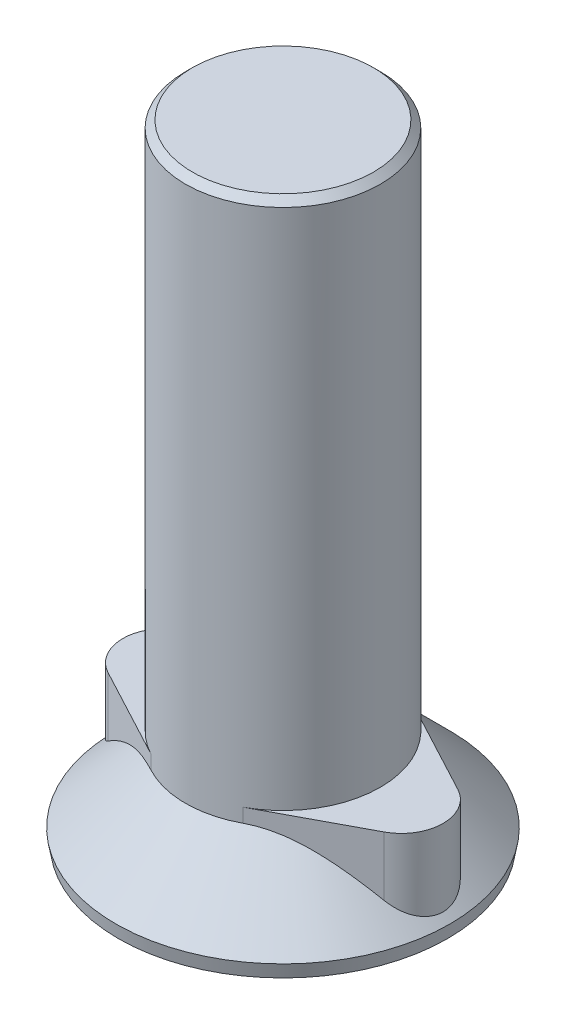
ISO-10303-21;
HEADER;
FILE_DESCRIPTION(('STEP AP214'),'2;1');
FILE_NAME('part.step','',(''),(''),'','','');
FILE_SCHEMA(('AUTOMOTIVE_DESIGN { 1 0 10303 214 1 1 1 1 }'));
ENDSEC;
DATA;
#1=APPLICATION_CONTEXT('core data for automotive mechanical design processes');
#2=APPLICATION_PROTOCOL_DEFINITION('international standard','automotive_design',2000,#1);
#3=PRODUCT_CONTEXT('',#1,'mechanical');
#4=PRODUCT('Part','Part','',(#3));
#5=PRODUCT_RELATED_PRODUCT_CATEGORY('part','',(#4));
#6=PRODUCT_DEFINITION_FORMATION('','',#4);
#7=PRODUCT_DEFINITION_CONTEXT('part definition',#1,'design');
#8=PRODUCT_DEFINITION('design','',#6,#7);
#9=PRODUCT_DEFINITION_SHAPE('','',#8);
#10=(LENGTH_UNIT() NAMED_UNIT(*) SI_UNIT(.MILLI.,.METRE.));
#11=(NAMED_UNIT(*) PLANE_ANGLE_UNIT() SI_UNIT($,.RADIAN.));
#12=(NAMED_UNIT(*) SI_UNIT($,.STERADIAN.) SOLID_ANGLE_UNIT());
#13=UNCERTAINTY_MEASURE_WITH_UNIT(LENGTH_MEASURE(1.E-05),#10,'distance_accuracy_value','');
#14=(GEOMETRIC_REPRESENTATION_CONTEXT(3) GLOBAL_UNCERTAINTY_ASSIGNED_CONTEXT((#13)) GLOBAL_UNIT_ASSIGNED_CONTEXT((#10,
#11,#12)) REPRESENTATION_CONTEXT('',''));
#15=CARTESIAN_POINT('',(0.,0.,0.));
#16=DIRECTION('',(0.,0.,1.));
#17=DIRECTION('',(1.,0.,0.));
#18=AXIS2_PLACEMENT_3D('',#15,#16,#17);
#19=CARTESIAN_POINT('',(0.,1.,0.));
#20=DIRECTION('',(0.,1.,0.));
#21=DIRECTION('',(-1.,0.,0.));
#22=AXIS2_PLACEMENT_3D('',#19,#20,#21);
#23=CONICAL_SURFACE('',#22,12.,0.174532925199435);
#24=CARTESIAN_POINT('',(0.,0.,0.));
#25=DIRECTION('',(0.,-1.,0.));
#26=DIRECTION('',(1.,0.,0.));
#27=AXIS2_PLACEMENT_3D('',#24,#25,#26);
#28=CIRCLE('',#27,11.8236730192915);
#29=CARTESIAN_POINT('',(11.8236730192915,0.,0.));
#30=VERTEX_POINT('',#29);
#31=EDGE_CURVE('E142',#30,#30,#28,.T.);
#32=ORIENTED_EDGE('',*,*,#31,.F.);
#33=EDGE_LOOP('',(#32));
#34=FACE_BOUND('',#33,.T.);
#35=CARTESIAN_POINT('',(0.,1.,0.));
#36=DIRECTION('',(0.,-1.,0.));
#37=DIRECTION('',(1.,0.,0.));
#38=AXIS2_PLACEMENT_3D('',#35,#36,#37);
#39=CIRCLE('',#38,12.);
#40=CARTESIAN_POINT('',(12.,1.,0.));
#41=VERTEX_POINT('',#40);
#42=EDGE_CURVE('E135',#41,#41,#39,.T.);
#43=ORIENTED_EDGE('',*,*,#42,.T.);
#44=EDGE_LOOP('',(#43));
#45=FACE_BOUND('',#44,.T.);
#46=ADVANCED_FACE('F17',(#34,#45),#23,.T.);
#47=CARTESIAN_POINT('',(-11.8236730192915,0.,0.));
#48=DIRECTION('',(0.,1.,0.));
#49=DIRECTION('',(-1.,0.,0.));
#50=AXIS2_PLACEMENT_3D('',#47,#48,#49);
#51=PLANE('',#50);
#52=ORIENTED_EDGE('',*,*,#31,.T.);
#53=EDGE_LOOP('',(#52));
#54=FACE_BOUND('',#53,.T.);
#55=ADVANCED_FACE('F206',(#54),#51,.F.);
#56=CARTESIAN_POINT('',(-7.,45.,0.));
#57=DIRECTION('',(0.,-1.,0.));
#58=DIRECTION('',(1.,0.,0.));
#59=AXIS2_PLACEMENT_3D('',#56,#57,#58);
#60=PLANE('',#59);
#61=CARTESIAN_POINT('',(0.,45.,0.));
#62=DIRECTION('',(0.,-1.,0.));
#63=DIRECTION('',(1.,0.,0.));
#64=AXIS2_PLACEMENT_3D('',#61,#62,#63);
#65=CIRCLE('',#64,6.5);
#66=CARTESIAN_POINT('',(6.5,45.,0.));
#67=VERTEX_POINT('',#66);
#68=EDGE_CURVE('E148',#67,#67,#65,.F.);
#69=ORIENTED_EDGE('',*,*,#68,.T.);
#70=EDGE_LOOP('',(#69));
#71=FACE_BOUND('',#70,.T.);
#72=ADVANCED_FACE('F209',(#71),#60,.F.);
#73=CARTESIAN_POINT('',(0.,0.,0.));
#74=DIRECTION('',(0.,-1.,0.));
#75=DIRECTION('',(1.,0.,0.));
#76=AXIS2_PLACEMENT_3D('',#73,#74,#75);
#77=CYLINDRICAL_SURFACE('',#76,7.);
#78=CARTESIAN_POINT('',(0.,7.,0.));
#79=DIRECTION('',(0.,1.,0.));
#80=DIRECTION('',(0.,0.,1.));
#81=AXIS2_PLACEMENT_3D('',#78,#79,#80);
#82=CIRCLE('',#81,7.);
#83=CARTESIAN_POINT('',(-3.29411764705882,7.,-6.1764705882353));
#84=VERTEX_POINT('',#83);
#85=CARTESIAN_POINT('',(-3.29411764705883,7.,6.1764705882353));
#86=VERTEX_POINT('',#85);
#87=EDGE_CURVE('E25',#84,#86,#82,.T.);
#88=ORIENTED_EDGE('',*,*,#87,.T.);
#89=DIRECTION('',(0.,1.,0.));
#90=VECTOR('',#89,1.);
#91=CARTESIAN_POINT('',(-3.29411764705883,-49.3648826841678,6.17647058823529));
#92=LINE('',#91,#90);
#93=CARTESIAN_POINT('',(-3.29411764705882,6.,6.1764705882353));
#94=VERTEX_POINT('',#93);
#95=EDGE_CURVE('E123',#94,#86,#92,.T.);
#96=ORIENTED_EDGE('',*,*,#95,.F.);
#97=CARTESIAN_POINT('',(0.,6.,0.));
#98=DIRECTION('',(0.,-1.,0.));
#99=DIRECTION('',(1.,0.,0.));
#100=AXIS2_PLACEMENT_3D('',#97,#98,#99);
#101=CIRCLE('',#100,7.);
#102=CARTESIAN_POINT('',(3.29411764705882,6.,6.17647058823529));
#103=VERTEX_POINT('',#102);
#104=EDGE_CURVE('E139',#103,#94,#101,.T.);
#105=ORIENTED_EDGE('',*,*,#104,.F.);
#106=DIRECTION('',(0.,1.,0.));
#107=VECTOR('',#106,1.);
#108=CARTESIAN_POINT('',(3.29411764705882,-49.3648826841678,6.17647058823529));
#109=LINE('',#108,#107);
#110=CARTESIAN_POINT('',(3.29411764705883,7.,6.1764705882353));
#111=VERTEX_POINT('',#110);
#112=EDGE_CURVE('E90',#103,#111,#109,.T.);
#113=ORIENTED_EDGE('',*,*,#112,.T.);
#114=CARTESIAN_POINT('',(3.29411764705883,7.,-6.17647058823529));
#115=VERTEX_POINT('',#114);
#116=EDGE_CURVE('E11',#111,#115,#82,.T.);
#117=ORIENTED_EDGE('',*,*,#116,.T.);
#118=DIRECTION('',(0.,1.,0.));
#119=VECTOR('',#118,1.);
#120=CARTESIAN_POINT('',(3.29411764705883,-49.3648826841678,-6.1764705882353));
#121=LINE('',#120,#119);
#122=CARTESIAN_POINT('',(3.29411764705883,6.,-6.1764705882353));
#123=VERTEX_POINT('',#122);
#124=EDGE_CURVE('E131',#123,#115,#121,.T.);
#125=ORIENTED_EDGE('',*,*,#124,.F.);
#126=CARTESIAN_POINT('',(-3.29411764705883,6.,-6.17647058823529));
#127=VERTEX_POINT('',#126);
#128=EDGE_CURVE('E138',#127,#123,#101,.T.);
#129=ORIENTED_EDGE('',*,*,#128,.F.);
#130=DIRECTION('',(0.,1.,0.));
#131=VECTOR('',#130,1.);
#132=CARTESIAN_POINT('',(-3.29411764705883,-49.3648826841678,-6.17647058823529));
#133=LINE('',#132,#131);
#134=EDGE_CURVE('E37',#127,#84,#133,.T.);
#135=ORIENTED_EDGE('',*,*,#134,.T.);
#136=EDGE_LOOP('',(#88,#96,#105,#113,#117,#125,#129,#135));
#137=FACE_BOUND('',#136,.T.);
#138=CARTESIAN_POINT('',(0.,44.5,0.));
#139=DIRECTION('',(0.,-1.,0.));
#140=DIRECTION('',(1.,0.,0.));
#141=AXIS2_PLACEMENT_3D('',#138,#139,#140);
#142=CIRCLE('',#141,7.);
#143=CARTESIAN_POINT('',(7.,44.5,0.));
#144=VERTEX_POINT('',#143);
#145=EDGE_CURVE('E145',#144,#144,#142,.T.);
#146=ORIENTED_EDGE('',*,*,#145,.T.);
#147=EDGE_LOOP('',(#146));
#148=FACE_BOUND('',#147,.T.);
#149=ADVANCED_FACE('F168',(#137,#148),#77,.T.);
#150=CARTESIAN_POINT('',(0.,6.,0.));
#151=DIRECTION('',(0.,-1.,0.));
#152=DIRECTION('',(1.,0.,0.));
#153=AXIS2_PLACEMENT_3D('',#150,#151,#152);
#154=CONICAL_SURFACE('',#153,7.,0.785398163397448);
#155=ORIENTED_EDGE('',*,*,#42,.F.);
#156=EDGE_LOOP('',(#155));
#157=FACE_BOUND('',#156,.T.);
#158=CARTESIAN_POINT('',(9.91156470588231,2.74102344285751,-2.6471654804918));
#159=CARTESIAN_POINT('',(9.98356228763569,2.6813690233866,-2.60875989639891));
#160=CARTESIAN_POINT('',(10.0547429674275,2.62291515063858,-2.56704011813073));
#161=CARTESIAN_POINT('',(10.1949975272901,2.50865949377154,-2.47668735347328));
#162=CARTESIAN_POINT('',(10.2640684597244,2.4528613643923,-2.42804518802902));
#163=CARTESIAN_POINT('',(10.4678434949442,2.289482024667,-2.27091453220468));
#164=CARTESIAN_POINT('',(10.5983245482079,2.18656351899434,-2.15162883713195));
#165=CARTESIAN_POINT('',(10.8179042134572,2.01545301821251,-1.91015412583546));
#166=CARTESIAN_POINT('',(10.9101511546149,1.94438047277255,-1.79284614702168));
#167=CARTESIAN_POINT('',(11.078544813732,1.81566307592463,-1.54075747818758));
#168=CARTESIAN_POINT('',(11.1547303186206,1.7579858409634,-1.40602017947054));
#169=CARTESIAN_POINT('',(11.2540827336964,1.68319667344774,-1.19219020079018));
#170=CARTESIAN_POINT('',(11.2848240043158,1.66013911881172,-1.11857608195092));
#171=CARTESIAN_POINT('',(11.3406495909173,1.61837100402448,-0.968059210193679));
#172=CARTESIAN_POINT('',(11.3657368330645,1.59965819515741,-0.89115818299993));
#173=CARTESIAN_POINT('',(11.4097950524654,1.5668557800292,-0.734643603530447));
#174=CARTESIAN_POINT('',(11.4287651648005,1.55276682754342,-0.655029669427046));
#175=CARTESIAN_POINT('',(11.4602113681981,1.52944091135658,-0.493863445710435));
#176=CARTESIAN_POINT('',(11.4726884763174,1.52020318776236,-0.412311461765094));
#177=CARTESIAN_POINT('',(11.4975567004263,1.50179903537242,-0.187528070329149));
#178=CARTESIAN_POINT('',(11.5031404568797,1.49767820549859,-0.0430304253434814));
#179=CARTESIAN_POINT('',(11.4934677937953,1.50482887618203,0.244746720529866));
#180=CARTESIAN_POINT('',(11.4782205054963,1.51609363250375,0.388026727469596));
#181=CARTESIAN_POINT('',(11.4292912768308,1.55236907438785,0.661431682632851));
#182=CARTESIAN_POINT('',(11.3966495011321,1.57660445860896,0.791849172672381));
#183=CARTESIAN_POINT('',(11.3154001499868,1.63722236263834,1.04458454172066));
#184=CARTESIAN_POINT('',(11.2667907200699,1.67360629337692,1.16690147795408));
#185=CARTESIAN_POINT('',(11.1523951334627,1.75977399970764,1.40846076964904));
#186=CARTESIAN_POINT('',(11.0857251433339,1.81025327532063,1.52703288430873));
#187=CARTESIAN_POINT('',(10.9398166952657,1.92164347121221,1.75076046805283));
#188=CARTESIAN_POINT('',(10.8605706292932,1.98256070783794,1.85590774570395));
#189=CARTESIAN_POINT('',(10.6797756354149,2.12287681013191,2.06654372299627));
#190=CARTESIAN_POINT('',(10.5766629248118,2.20367701541225,2.16974887682783));
#191=CARTESIAN_POINT('',(10.3613784534969,2.37452551412365,2.35704138781548));
#192=CARTESIAN_POINT('',(10.2492078988461,2.46457257675891,2.44113128451714));
#193=CARTESIAN_POINT('',(10.0609620453849,2.61780602763353,2.563395423371));
#194=CARTESIAN_POINT('',(9.98666376414196,2.67879336612834,2.6071233447852));
#195=CARTESIAN_POINT('',(9.91156470588247,2.74102344285723,2.64716548049241));
#196=B_SPLINE_CURVE_WITH_KNOTS('',3,(#158,#159,#160,#161,#162,#163,#164,#165,#166,#167,#168,
#169,#170,#171,#172,#173,#174,#175,#176,#177,#178,#179,#180,#181,#182,#183,#184,#185,#186,#187,
#188,#189,#190,#191,#192,#193,#194,#195),.UNSPECIFIED.,.F.,.F.,(4,2,2,2,2,2,2,2,2,2,2,2,2,2,2,2,
2,2,4),(0.,0.303094887368615,0.606595488202654,1.21685044894229,1.71086386790831,
2.20367026572788,2.45248273555658,2.70116613867642,2.94988468845559,3.19856426750302,
3.63007339172932,4.06139342563936,4.46941718691488,4.8774883524999,5.31107016433642,
5.74491528316431,6.24340392627657,6.74182630423488,7.05823895159525),.UNSPECIFIED.);
#197=CARTESIAN_POINT('',(9.91176470588235,2.74085773565842,-2.64705882352941));
#198=VERTEX_POINT('',#197);
#199=CARTESIAN_POINT('',(9.91176470588235,2.74085773565842,2.64705882352942));
#200=VERTEX_POINT('',#199);
#201=EDGE_CURVE('E189',#198,#200,#196,.T.);
#202=ORIENTED_EDGE('',*,*,#201,.T.);
#203=CARTESIAN_POINT('',(9.91196470588235,2.74069202863187,2.64695215686275));
#204=CARTESIAN_POINT('',(9.72835052259684,2.89277280279003,2.74487972128169));
#205=CARTESIAN_POINT('',(9.54352151818006,3.04301127560552,2.84345519030397));
#206=CARTESIAN_POINT('',(9.17089129154001,3.33888277104574,3.04219131117866));
#207=CARTESIAN_POINT('',(8.9830887219807,3.48451361080487,3.14235268161029));
#208=CARTESIAN_POINT('',(8.60198495881039,3.77172880173203,3.34560802196779));
#209=CARTESIAN_POINT('',(8.40864552374487,3.91324831382766,3.44872238733607));
#210=CARTESIAN_POINT('',(8.01802078995133,4.18905779346685,3.65705557869262));
#211=CARTESIAN_POINT('',(7.8207360738577,4.32334881784821,3.76227409394256));
#212=CARTESIAN_POINT('',(7.43095847625734,4.57680979081243,3.97015547932942));
#213=CARTESIAN_POINT('',(7.23867786540349,4.69639408454862,4.07270513845147));
#214=CARTESIAN_POINT('',(6.84944967017922,4.92532994224692,4.28029350923774));
#215=CARTESIAN_POINT('',(6.65250121543302,5.03467957871976,4.38533268510238));
#216=CARTESIAN_POINT('',(6.05553260949519,5.34273579066558,4.70371594160256));
#217=CARTESIAN_POINT('',(5.64740426392446,5.52279774997197,4.92138439257362));
#218=CARTESIAN_POINT('',(5.07373263845529,5.7171686094611,5.22734259282384));
#219=CARTESIAN_POINT('',(4.91678444013114,5.76456152448375,5.31104829859672));
#220=CARTESIAN_POINT('',(4.6003783765999,5.84729209850646,5.47979819914671));
#221=CARTESIAN_POINT('',(4.44092024180351,5.88262845315405,5.56484253770479));
#222=CARTESIAN_POINT('',(4.11749377145424,5.94042908089592,5.7373366552244));
#223=CARTESIAN_POINT('',(3.95349429453841,5.96267397825909,5.82480304291284));
#224=CARTESIAN_POINT('',(3.70666436163076,5.98502086323628,5.95644567379692));
#225=CARTESIAN_POINT('',(3.62420063374052,5.99063313364621,6.00042632867172));
#226=CARTESIAN_POINT('',(3.45913349702899,5.99812685374959,6.08846213491787));
#227=CARTESIAN_POINT('',(3.37653007537661,6.00000793975191,6.13251729313247));
#228=CARTESIAN_POINT('',(3.29391764705882,5.99999999633017,6.17657725490196));
#229=B_SPLINE_CURVE_WITH_KNOTS('',3,(#203,#204,#205,#206,#207,#208,#209,#210,#211,#212,#213,
#214,#215,#216,#217,#218,#219,#220,#221,#222,#223,#224,#225,#226,#227,#228),.UNSPECIFIED.,.F.,
.F.,(4,2,2,2,2,2,2,2,2,2,2,2,4),(0.,0.773261265163307,1.54688353824095,2.32930229541198,
3.11160634693998,3.85704643188644,4.60262662399333,6.08594642886971,6.63785559643804,
7.18982445399828,7.75079718467654,8.03161328698054,8.31245676003215),.UNSPECIFIED.);
#230=EDGE_CURVE('E87',#200,#103,#229,.T.);
#231=ORIENTED_EDGE('',*,*,#230,.T.);
#232=ORIENTED_EDGE('',*,*,#104,.T.);
#233=CARTESIAN_POINT('',(-3.29391764705882,5.99999999633016,6.17657725490196));
#234=CARTESIAN_POINT('',(-3.38889550526617,6.00001602368897,6.12592239719137));
#235=CARTESIAN_POINT('',(-3.48386963066223,5.99752443247155,6.07526953031347));
#236=CARTESIAN_POINT('',(-3.67360272343958,5.98761917923993,5.97407854749889));
#237=CARTESIAN_POINT('',(-3.76836172366816,5.98020632761133,5.92354041404365));
#238=CARTESIAN_POINT('',(-3.95731037002711,5.96057015246898,5.8227678026522));
#239=CARTESIAN_POINT('',(-4.05150075190511,5.94835590516197,5.77253293231727));
#240=CARTESIAN_POINT('',(-4.23931958898048,5.91929318588809,5.67236288587707));
#241=CARTESIAN_POINT('',(-4.33294802478376,5.90244455490671,5.62242772011532));
#242=CARTESIAN_POINT('',(-4.609504255713,5.84593062841855,5.47493106361973));
#243=CARTESIAN_POINT('',(-4.79144702353566,5.79993391018451,5.37789492078098));
#244=CARTESIAN_POINT('',(-5.15182380773045,5.69289389706411,5.18569396921043));
#245=CARTESIAN_POINT('',(-5.33025702439344,5.63184721471962,5.09052958699017));
#246=CARTESIAN_POINT('',(-5.70293729004415,5.48940367187028,4.89176677864312));
#247=CARTESIAN_POINT('',(-5.89673231525854,5.40649757578047,4.78840943186211));
#248=CARTESIAN_POINT('',(-6.27961985863406,5.22765030996915,4.58420274206183));
#249=CARTESIAN_POINT('',(-6.46871035733531,5.13170365290497,4.48335447608783));
#250=CARTESIAN_POINT('',(-6.84299343312791,4.9289316320822,4.28373683566511));
#251=CARTESIAN_POINT('',(-7.02817184209876,4.82207292534491,4.18497501754732));
#252=CARTESIAN_POINT('',(-7.39441126524149,4.59976813186721,3.98964732520453));
#253=CARTESIAN_POINT('',(-7.5754728504216,4.48432324564444,3.89308114644181));
#254=CARTESIAN_POINT('',(-7.94186434907571,4.24120890718177,3.69767234715962));
#255=CARTESIAN_POINT('',(-8.12703107912824,4.11322499506271,3.59891675779827));
#256=CARTESIAN_POINT('',(-8.49393723982107,3.85106887248552,3.40323347209542));
#257=CARTESIAN_POINT('',(-8.67567627456557,3.71689595329477,3.30630598689835));
#258=CARTESIAN_POINT('',(-9.03464495454188,3.4446646536357,3.11485602424433));
#259=CARTESIAN_POINT('',(-9.21189971863898,3.30664864774384,3.02032015005921));
#260=CARTESIAN_POINT('',(-9.56378667996042,3.02653602297223,2.83264710402111));
#261=CARTESIAN_POINT('',(-9.73841982143827,2.8844409297415,2.73950942856625));
#262=CARTESIAN_POINT('',(-9.91196470588235,2.74069202863186,2.64695215686275));
#263=B_SPLINE_CURVE_WITH_KNOTS('',3,(#233,#234,#235,#236,#237,#238,#239,#240,#241,#242,#243,
#244,#245,#246,#247,#248,#249,#250,#251,#252,#253,#254,#255,#256,#257,#258,#259,#260,#261,#262),
.UNSPECIFIED.,.F.,.F.,(4,2,2,2,2,2,2,2,2,2,2,2,2,2,4),(0.,0.322888649853048,0.645724142707506,
0.967952283164564,1.29019148126131,1.92328489100783,2.55652092823922,3.26028188350172,
3.96433989676975,4.67061754875083,5.37679663413047,6.11407510539586,6.85143821655157,
7.58257514629205,8.31344209239549),.UNSPECIFIED.);
#264=CARTESIAN_POINT('',(-9.91176470588235,2.7408577356584,2.64705882352941));
#265=VERTEX_POINT('',#264);
#266=EDGE_CURVE('E151',#94,#265,#263,.T.);
#267=ORIENTED_EDGE('',*,*,#266,.T.);
#268=CARTESIAN_POINT('',(-9.91156470588231,2.74102344285751,2.6471654804918));
#269=CARTESIAN_POINT('',(-9.98356228763569,2.68136902338659,2.60875989639891));
#270=CARTESIAN_POINT('',(-10.0547429674275,2.62291515063856,2.56704011813073));
#271=CARTESIAN_POINT('',(-10.1949975272901,2.50865949377153,2.47668735347328));
#272=CARTESIAN_POINT('',(-10.2640684597244,2.45286136439229,2.42804518802903));
#273=CARTESIAN_POINT('',(-10.4678434949442,2.28948202466699,2.27091453220468));
#274=CARTESIAN_POINT('',(-10.5983245482079,2.18656351899433,2.15162883713195));
#275=CARTESIAN_POINT('',(-10.8179042134572,2.0154530182125,1.91015412583546));
#276=CARTESIAN_POINT('',(-10.9101511546149,1.94438047277254,1.79284614702168));
#277=CARTESIAN_POINT('',(-11.078544813732,1.81566307592462,1.54075747818759));
#278=CARTESIAN_POINT('',(-11.1547303186206,1.75798584096339,1.40602017947054));
#279=CARTESIAN_POINT('',(-11.2540827336964,1.68319667344773,1.19219020079019));
#280=CARTESIAN_POINT('',(-11.2848240043158,1.66013911881171,1.11857608195092));
#281=CARTESIAN_POINT('',(-11.3406495909173,1.61837100402447,0.968059210193682));
#282=CARTESIAN_POINT('',(-11.3657368330645,1.5996581951574,0.891158182999931));
#283=CARTESIAN_POINT('',(-11.4097950524654,1.5668557800292,0.734643603530447));
#284=CARTESIAN_POINT('',(-11.4287651648005,1.55276682754341,0.655029669427047));
#285=CARTESIAN_POINT('',(-11.4602113681981,1.52944091135657,0.493863445710436));
#286=CARTESIAN_POINT('',(-11.4726884763174,1.52020318776235,0.412311461765095));
#287=CARTESIAN_POINT('',(-11.4975567004263,1.50179903537241,0.18752807032915));
#288=CARTESIAN_POINT('',(-11.5031404568797,1.49767820549858,0.0430304253434821));
#289=CARTESIAN_POINT('',(-11.4934677937953,1.50482887618202,-0.244746720529865));
#290=CARTESIAN_POINT('',(-11.4782205054963,1.51609363250374,-0.388026727469594));
#291=CARTESIAN_POINT('',(-11.4292912768308,1.55236907438784,-0.661431682632849));
#292=CARTESIAN_POINT('',(-11.3966495011321,1.57660445860895,-0.791849172672378));
#293=CARTESIAN_POINT('',(-11.3154001499868,1.63722236263833,-1.04458454172065));
#294=CARTESIAN_POINT('',(-11.2667907200699,1.67360629337691,-1.16690147795407));
#295=CARTESIAN_POINT('',(-11.1523951334627,1.75977399970764,-1.40846076964903));
#296=CARTESIAN_POINT('',(-11.0857251433339,1.81025327532062,-1.52703288430872));
#297=CARTESIAN_POINT('',(-10.9398166952657,1.9216434712122,-1.75076046805283));
#298=CARTESIAN_POINT('',(-10.8605706292932,1.98256070783793,-1.85590774570395));
#299=CARTESIAN_POINT('',(-10.6797756354149,2.1228768101319,-2.06654372299627));
#300=CARTESIAN_POINT('',(-10.5766629248118,2.20367701541224,-2.16974887682783));
#301=CARTESIAN_POINT('',(-10.3613784534969,2.37452551412365,-2.35704138781548));
#302=CARTESIAN_POINT('',(-10.2492078988461,2.4645725767589,-2.44113128451714));
#303=CARTESIAN_POINT('',(-10.0609620453849,2.61780602763351,-2.563395423371));
#304=CARTESIAN_POINT('',(-9.98666376414196,2.67879336612833,-2.6071233447852));
#305=CARTESIAN_POINT('',(-9.91156470588248,2.74102344285722,-2.64716548049241));
#306=B_SPLINE_CURVE_WITH_KNOTS('',3,(#268,#269,#270,#271,#272,#273,#274,#275,#276,#277,#278,
#279,#280,#281,#282,#283,#284,#285,#286,#287,#288,#289,#290,#291,#292,#293,#294,#295,#296,#297,
#298,#299,#300,#301,#302,#303,#304,#305),.UNSPECIFIED.,.F.,.F.,(4,2,2,2,2,2,2,2,2,2,2,2,2,2,2,2,
2,2,4),(0.,0.303094887368614,0.606595488202654,1.21685044894229,1.71086386790831,
2.20367026572788,2.45248273555658,2.70116613867642,2.94988468845559,3.19856426750302,
3.63007339172932,4.06139342563936,4.46941718691488,4.8774883524999,5.31107016433642,
5.74491528316431,6.24340392627657,6.74182630423488,7.05823895159524),.UNSPECIFIED.);
#307=CARTESIAN_POINT('',(-9.91176470588235,2.7408577356584,-2.64705882352942));
#308=VERTEX_POINT('',#307);
#309=EDGE_CURVE('E157',#265,#308,#306,.T.);
#310=ORIENTED_EDGE('',*,*,#309,.T.);
#311=CARTESIAN_POINT('',(-9.91196470588235,2.74069202863186,-2.64695215686275));
#312=CARTESIAN_POINT('',(-9.72835052259684,2.89277280279002,-2.74487972128169));
#313=CARTESIAN_POINT('',(-9.54352151818006,3.04301127560551,-2.84345519030397));
#314=CARTESIAN_POINT('',(-9.17089129154001,3.33888277104572,-3.04219131117866));
#315=CARTESIAN_POINT('',(-8.98308872198071,3.48451361080486,-3.14235268161029));
#316=CARTESIAN_POINT('',(-8.6019849588104,3.77172880173202,-3.34560802196779));
#317=CARTESIAN_POINT('',(-8.40864552374487,3.91324831382765,-3.44872238733607));
#318=CARTESIAN_POINT('',(-8.01802078995133,4.18905779346684,-3.65705557869263));
#319=CARTESIAN_POINT('',(-7.82073607385771,4.32334881784819,-3.76227409394256));
#320=CARTESIAN_POINT('',(-7.43095847625734,4.57680979081242,-3.97015547932942));
#321=CARTESIAN_POINT('',(-7.2386778654035,4.6963940845486,-4.07270513845147));
#322=CARTESIAN_POINT('',(-6.84944967017923,4.92532994224691,-4.28029350923775));
#323=CARTESIAN_POINT('',(-6.65250121543302,5.03467957871974,-4.38533268510239));
#324=CARTESIAN_POINT('',(-6.05553260949519,5.34273579066556,-4.70371594160257));
#325=CARTESIAN_POINT('',(-5.64740426392446,5.52279774997196,-4.92138439257362));
#326=CARTESIAN_POINT('',(-5.07373263845529,5.71716860946109,-5.22734259282385));
#327=CARTESIAN_POINT('',(-4.91678444013114,5.76456152448374,-5.31104829859673));
#328=CARTESIAN_POINT('',(-4.60037837659991,5.84729209850644,-5.47979819914672));
#329=CARTESIAN_POINT('',(-4.44092024180352,5.88262845315403,-5.5648425377048));
#330=CARTESIAN_POINT('',(-4.11749377145425,5.9404290808959,-5.73733665522441));
#331=CARTESIAN_POINT('',(-3.95349429453842,5.96267397825907,-5.82480304291285));
#332=CARTESIAN_POINT('',(-3.70666436163077,5.98502086323626,-5.95644567379693));
#333=CARTESIAN_POINT('',(-3.62420063374053,5.9906331336462,-6.00042632867172));
#334=CARTESIAN_POINT('',(-3.459133497029,5.99812685374958,-6.08846213491787));
#335=CARTESIAN_POINT('',(-3.37653007537662,6.00000793975189,-6.13251729313247));
#336=CARTESIAN_POINT('',(-3.29391764705882,5.99999999633016,-6.17657725490196));
#337=B_SPLINE_CURVE_WITH_KNOTS('',3,(#311,#312,#313,#314,#315,#316,#317,#318,#319,#320,#321,
#322,#323,#324,#325,#326,#327,#328,#329,#330,#331,#332,#333,#334,#335,#336),.UNSPECIFIED.,.F.,
.F.,(4,2,2,2,2,2,2,2,2,2,2,2,4),(0.,0.773261265163306,1.54688353824095,2.32930229541198,
3.11160634693998,3.85704643188644,4.60262662399333,6.08594642886971,6.63785559643804,
7.18982445399828,7.75079718467654,8.03161328698054,8.31245676003215),.UNSPECIFIED.);
#338=EDGE_CURVE('E177',#308,#127,#337,.T.);
#339=ORIENTED_EDGE('',*,*,#338,.T.);
#340=ORIENTED_EDGE('',*,*,#128,.T.);
#341=CARTESIAN_POINT('',(3.29391764705883,5.99999999633016,-6.17657725490196));
#342=CARTESIAN_POINT('',(3.38889550526618,6.00001602368897,-6.12592239719138));
#343=CARTESIAN_POINT('',(3.48386963066224,5.99752443247155,-6.07526953031348));
#344=CARTESIAN_POINT('',(3.67360272343959,5.98761917923992,-5.9740785474989));
#345=CARTESIAN_POINT('',(3.76836172366817,5.98020632761132,-5.92354041404365));
#346=CARTESIAN_POINT('',(3.95731037002712,5.96057015246897,-5.82276780265221));
#347=CARTESIAN_POINT('',(4.05150075190511,5.94835590516196,-5.77253293231728));
#348=CARTESIAN_POINT('',(4.23931958898049,5.91929318588808,-5.67236288587708));
#349=CARTESIAN_POINT('',(4.33294802478377,5.9024445549067,-5.62242772011533));
#350=CARTESIAN_POINT('',(4.60950425571301,5.84593062841854,-5.47493106361974));
#351=CARTESIAN_POINT('',(4.79144702353566,5.7999339101845,-5.37789492078099));
#352=CARTESIAN_POINT('',(5.15182380773045,5.6928938970641,-5.18569396921043));
#353=CARTESIAN_POINT('',(5.33025702439344,5.63184721471962,-5.09052958699017));
#354=CARTESIAN_POINT('',(5.70293729004415,5.48940367187028,-4.89176677864312));
#355=CARTESIAN_POINT('',(5.89673231525854,5.40649757578047,-4.78840943186212));
#356=CARTESIAN_POINT('',(6.27961985863406,5.22765030996915,-4.58420274206184));
#357=CARTESIAN_POINT('',(6.46871035733531,5.13170365290496,-4.48335447608784));
#358=CARTESIAN_POINT('',(6.84299343312791,4.9289316320822,-4.28373683566512));
#359=CARTESIAN_POINT('',(7.02817184209876,4.82207292534491,-4.18497501754734));
#360=CARTESIAN_POINT('',(7.39441126524149,4.59976813186721,-3.98964732520454));
#361=CARTESIAN_POINT('',(7.5754728504216,4.48432324564444,-3.89308114644182));
#362=CARTESIAN_POINT('',(7.94186434907571,4.24120890718177,-3.69767234715963));
#363=CARTESIAN_POINT('',(8.12703107912824,4.11322499506271,-3.59891675779828));
#364=CARTESIAN_POINT('',(8.49393723982108,3.85106887248553,-3.40323347209543));
#365=CARTESIAN_POINT('',(8.67567627456558,3.71689595329477,-3.30630598689837));
#366=CARTESIAN_POINT('',(9.03464495454188,3.44466465363571,-3.11485602424434));
#367=CARTESIAN_POINT('',(9.21189971863898,3.30664864774384,-3.02032015005922));
#368=CARTESIAN_POINT('',(9.56378667996042,3.02653602297223,-2.83264710402111));
#369=CARTESIAN_POINT('',(9.73841982143828,2.88444092974151,-2.73950942856626));
#370=CARTESIAN_POINT('',(9.91196470588235,2.74069202863187,-2.64695215686275));
#371=B_SPLINE_CURVE_WITH_KNOTS('',3,(#341,#342,#343,#344,#345,#346,#347,#348,#349,#350,#351,
#352,#353,#354,#355,#356,#357,#358,#359,#360,#361,#362,#363,#364,#365,#366,#367,#368,#369,#370),
.UNSPECIFIED.,.F.,.F.,(4,2,2,2,2,2,2,2,2,2,2,2,2,2,4),(0.,0.322888649853047,0.645724142707505,
0.967952283164561,1.29019148126131,1.92328489100783,2.55652092823921,3.26028188350171,
3.96433989676974,4.67061754875082,5.37679663413046,6.11407510539585,6.85143821655156,
7.58257514629204,8.31344209239548),.UNSPECIFIED.);
#372=EDGE_CURVE('E183',#123,#198,#371,.T.);
#373=ORIENTED_EDGE('',*,*,#372,.T.);
#374=EDGE_LOOP('',(#202,#231,#232,#267,#310,#339,#340,#373));
#375=FACE_BOUND('',#374,.T.);
#376=ADVANCED_FACE('F162',(#157,#375),#154,.T.);
#377=CARTESIAN_POINT('',(0.,44.5,0.));
#378=DIRECTION('',(0.,-1.,0.));
#379=DIRECTION('',(1.,0.,0.));
#380=AXIS2_PLACEMENT_3D('',#377,#378,#379);
#381=CONICAL_SURFACE('',#380,7.,0.785398163397448);
#382=ORIENTED_EDGE('',*,*,#68,.F.);
#383=EDGE_LOOP('',(#382));
#384=FACE_BOUND('',#383,.T.);
#385=ORIENTED_EDGE('',*,*,#145,.F.);
#386=EDGE_LOOP('',(#385));
#387=FACE_BOUND('',#386,.T.);
#388=ADVANCED_FACE('F167',(#384,#387),#381,.T.);
#389=CARTESIAN_POINT('',(3.29411764705883,-49.3648826841678,-6.1764705882353));
#390=DIRECTION('',(0.470588235294118,0.,-0.882352941176471));
#391=DIRECTION('',(-0.882352941176471,0.,-0.470588235294118));
#392=AXIS2_PLACEMENT_3D('',#389,#390,#391);
#393=PLANE('',#392);
#394=ORIENTED_EDGE('',*,*,#372,.F.);
#395=ORIENTED_EDGE('',*,*,#124,.T.);
#396=DIRECTION('',(-0.88235294117647,0.,-0.470588235294118));
#397=VECTOR('',#396,1.);
#398=CARTESIAN_POINT('',(3.29411764705883,7.,-6.1764705882353));
#399=LINE('',#398,#397);
#400=CARTESIAN_POINT('',(9.91176470588235,7.,-2.64705882352941));
#401=VERTEX_POINT('',#400);
#402=EDGE_CURVE('E101',#401,#115,#399,.T.);
#403=ORIENTED_EDGE('',*,*,#402,.F.);
#404=DIRECTION('',(0.,1.,0.));
#405=VECTOR('',#404,1.);
#406=CARTESIAN_POINT('',(9.91176470588235,-49.3648826841678,-2.64705882352941));
#407=LINE('',#406,#405);
#408=EDGE_CURVE('E91',#198,#401,#407,.T.);
#409=ORIENTED_EDGE('',*,*,#408,.F.);
#410=EDGE_LOOP('',(#394,#395,#403,#409));
#411=FACE_BOUND('',#410,.T.);
#412=ADVANCED_FACE('F221',(#411),#393,.T.);
#413=CARTESIAN_POINT('',(3.29411764705882,-49.3648826841678,6.17647058823529));
#414=DIRECTION('',(0.470588235294117,0.,0.882352941176471));
#415=DIRECTION('',(0.882352941176471,0.,-0.470588235294117));
#416=AXIS2_PLACEMENT_3D('',#413,#414,#415);
#417=PLANE('',#416);
#418=ORIENTED_EDGE('',*,*,#230,.F.);
#419=DIRECTION('',(0.,1.,0.));
#420=VECTOR('',#419,1.);
#421=CARTESIAN_POINT('',(9.91176470588235,-49.3648826841678,2.64705882352942));
#422=LINE('',#421,#420);
#423=CARTESIAN_POINT('',(9.91176470588235,7.,2.64705882352942));
#424=VERTEX_POINT('',#423);
#425=EDGE_CURVE('E80',#200,#424,#422,.T.);
#426=ORIENTED_EDGE('',*,*,#425,.T.);
#427=DIRECTION('',(0.882352941176471,0.,-0.470588235294117));
#428=VECTOR('',#427,1.);
#429=CARTESIAN_POINT('',(3.29411764705882,7.,6.17647058823529));
#430=LINE('',#429,#428);
#431=EDGE_CURVE('E85',#111,#424,#430,.T.);
#432=ORIENTED_EDGE('',*,*,#431,.F.);
#433=ORIENTED_EDGE('',*,*,#112,.F.);
#434=EDGE_LOOP('',(#418,#426,#432,#433));
#435=FACE_BOUND('',#434,.T.);
#436=ADVANCED_FACE('F82',(#435),#417,.T.);
#437=CARTESIAN_POINT('',(0.,7.,0.));
#438=DIRECTION('',(0.,1.,0.));
#439=DIRECTION('',(0.,0.,1.));
#440=AXIS2_PLACEMENT_3D('',#437,#438,#439);
#441=PLANE('',#440);
#442=ORIENTED_EDGE('',*,*,#116,.F.);
#443=ORIENTED_EDGE('',*,*,#431,.T.);
#444=CARTESIAN_POINT('',(8.5,7.,0.));
#445=DIRECTION('',(0.,1.,0.));
#446=DIRECTION('',(-1.,0.,0.));
#447=AXIS2_PLACEMENT_3D('',#444,#445,#446);
#448=CIRCLE('',#447,3.);
#449=EDGE_CURVE('E94',#424,#401,#448,.T.);
#450=ORIENTED_EDGE('',*,*,#449,.T.);
#451=ORIENTED_EDGE('',*,*,#402,.T.);
#452=EDGE_LOOP('',(#442,#443,#450,#451));
#453=FACE_BOUND('',#452,.T.);
#454=ADVANCED_FACE('F103',(#453),#441,.T.);
#455=CARTESIAN_POINT('',(8.5,-49.3648826841678,0.));
#456=DIRECTION('',(0.,1.,0.));
#457=DIRECTION('',(0.,0.,1.));
#458=AXIS2_PLACEMENT_3D('',#455,#456,#457);
#459=CYLINDRICAL_SURFACE('',#458,3.);
#460=ORIENTED_EDGE('',*,*,#201,.F.);
#461=ORIENTED_EDGE('',*,*,#408,.T.);
#462=ORIENTED_EDGE('',*,*,#449,.F.);
#463=ORIENTED_EDGE('',*,*,#425,.F.);
#464=EDGE_LOOP('',(#460,#461,#462,#463));
#465=FACE_BOUND('',#464,.T.);
#466=ADVANCED_FACE('F95',(#465),#459,.T.);
#467=ORIENTED_EDGE('',*,*,#87,.F.);
#468=DIRECTION('',(-0.882352941176471,0.,0.470588235294118));
#469=VECTOR('',#468,1.);
#470=CARTESIAN_POINT('',(-3.29411764705883,7.,-6.1764705882353));
#471=LINE('',#470,#469);
#472=CARTESIAN_POINT('',(-9.91176470588235,7.,-2.64705882352941));
#473=VERTEX_POINT('',#472);
#474=EDGE_CURVE('E111',#84,#473,#471,.T.);
#475=ORIENTED_EDGE('',*,*,#474,.T.);
#476=CARTESIAN_POINT('',(-8.5,7.,0.));
#477=DIRECTION('',(0.,1.,0.));
#478=DIRECTION('',(1.,0.,0.));
#479=AXIS2_PLACEMENT_3D('',#476,#477,#478);
#480=CIRCLE('',#479,3.);
#481=CARTESIAN_POINT('',(-9.91176470588235,7.,2.64705882352941));
#482=VERTEX_POINT('',#481);
#483=EDGE_CURVE('E115',#473,#482,#480,.T.);
#484=ORIENTED_EDGE('',*,*,#483,.T.);
#485=DIRECTION('',(0.882352941176471,0.,0.470588235294118));
#486=VECTOR('',#485,1.);
#487=CARTESIAN_POINT('',(-3.29411764705883,7.,6.17647058823529));
#488=LINE('',#487,#486);
#489=EDGE_CURVE('E119',#482,#86,#488,.T.);
#490=ORIENTED_EDGE('',*,*,#489,.T.);
#491=EDGE_LOOP('',(#467,#475,#484,#490));
#492=FACE_BOUND('',#491,.T.);
#493=ADVANCED_FACE('F240',(#492),#441,.T.);
#494=CARTESIAN_POINT('',(-3.29411764705883,-49.3648826841678,-6.1764705882353));
#495=DIRECTION('',(-0.470588235294118,0.,-0.882352941176471));
#496=DIRECTION('',(-0.882352941176471,0.,0.470588235294118));
#497=AXIS2_PLACEMENT_3D('',#494,#495,#496);
#498=PLANE('',#497);
#499=ORIENTED_EDGE('',*,*,#338,.F.);
#500=DIRECTION('',(0.,1.,0.));
#501=VECTOR('',#500,1.);
#502=CARTESIAN_POINT('',(-9.91176470588235,-49.3648826841678,-2.64705882352941));
#503=LINE('',#502,#501);
#504=EDGE_CURVE('E128',#308,#473,#503,.T.);
#505=ORIENTED_EDGE('',*,*,#504,.T.);
#506=ORIENTED_EDGE('',*,*,#474,.F.);
#507=ORIENTED_EDGE('',*,*,#134,.F.);
#508=EDGE_LOOP('',(#499,#505,#506,#507));
#509=FACE_BOUND('',#508,.T.);
#510=ADVANCED_FACE('F236',(#509),#498,.T.);
#511=CARTESIAN_POINT('',(-8.5,-49.3648826841678,0.));
#512=DIRECTION('',(0.,1.,0.));
#513=DIRECTION('',(0.,0.,1.));
#514=AXIS2_PLACEMENT_3D('',#511,#512,#513);
#515=CYLINDRICAL_SURFACE('',#514,3.);
#516=ORIENTED_EDGE('',*,*,#309,.F.);
#517=DIRECTION('',(0.,1.,0.));
#518=VECTOR('',#517,1.);
#519=CARTESIAN_POINT('',(-9.91176470588235,-49.3648826841678,2.64705882352941));
#520=LINE('',#519,#518);
#521=EDGE_CURVE('E126',#265,#482,#520,.T.);
#522=ORIENTED_EDGE('',*,*,#521,.T.);
#523=ORIENTED_EDGE('',*,*,#483,.F.);
#524=ORIENTED_EDGE('',*,*,#504,.F.);
#525=EDGE_LOOP('',(#516,#522,#523,#524));
#526=FACE_BOUND('',#525,.T.);
#527=ADVANCED_FACE('F239',(#526),#515,.T.);
#528=CARTESIAN_POINT('',(-3.29411764705883,-49.3648826841678,6.17647058823529));
#529=DIRECTION('',(-0.470588235294118,0.,0.882352941176471));
#530=DIRECTION('',(0.882352941176471,0.,0.470588235294118));
#531=AXIS2_PLACEMENT_3D('',#528,#529,#530);
#532=PLANE('',#531);
#533=ORIENTED_EDGE('',*,*,#266,.F.);
#534=ORIENTED_EDGE('',*,*,#95,.T.);
#535=ORIENTED_EDGE('',*,*,#489,.F.);
#536=ORIENTED_EDGE('',*,*,#521,.F.);
#537=EDGE_LOOP('',(#533,#534,#535,#536));
#538=FACE_BOUND('',#537,.T.);
#539=ADVANCED_FACE('F243',(#538),#532,.T.);
#540=CLOSED_SHELL('',(#46,#55,#72,#149,#376,#388,#412,#436,#454,#466,#493,#510,#527,#539));
#541=MANIFOLD_SOLID_BREP('B1',#540);
#542=ADVANCED_BREP_SHAPE_REPRESENTATION('',(#18,#541),#14);
#543=SHAPE_DEFINITION_REPRESENTATION(#9,#542);
ENDSEC;
END-ISO-10303-21;
